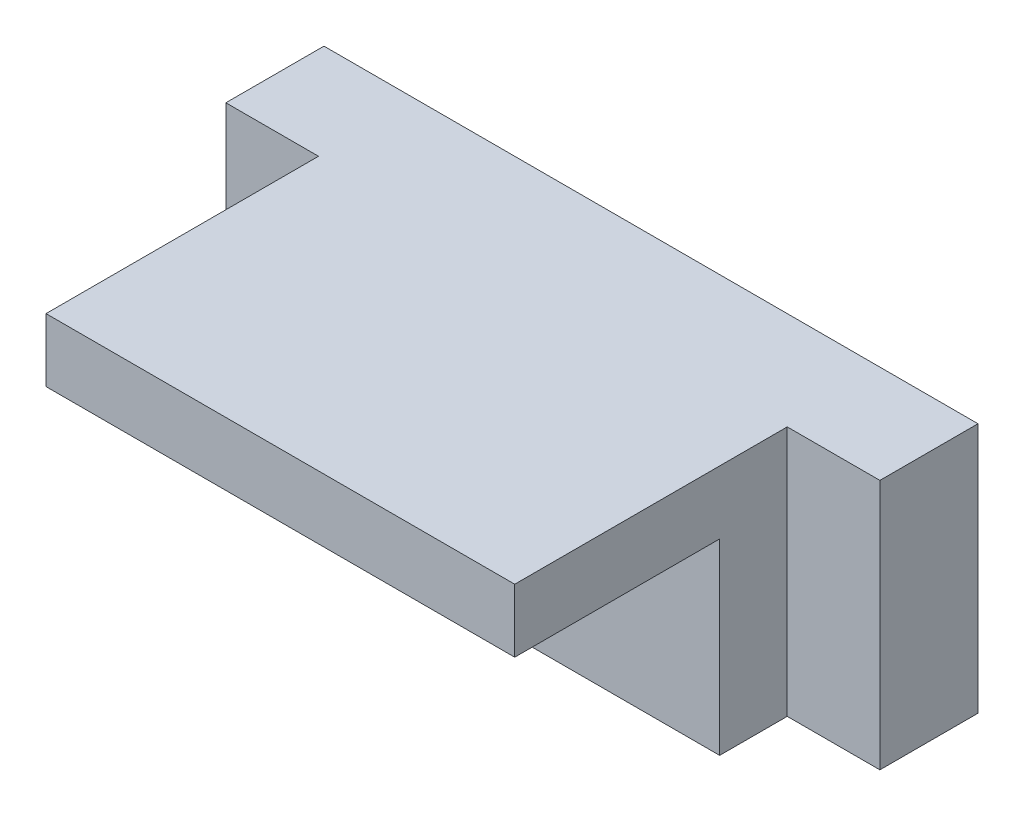
ISO-10303-21;
HEADER;
FILE_DESCRIPTION(('STEP AP214'),'2;1');
FILE_NAME('part.step','',(''),(''),'','','');
FILE_SCHEMA(('AUTOMOTIVE_DESIGN { 1 0 10303 214 1 1 1 1 }'));
ENDSEC;
DATA;
#1=APPLICATION_CONTEXT('core data for automotive mechanical design processes');
#2=APPLICATION_PROTOCOL_DEFINITION('international standard','automotive_design',2000,#1);
#3=PRODUCT_CONTEXT('',#1,'mechanical');
#4=PRODUCT('Part','Part','',(#3));
#5=PRODUCT_RELATED_PRODUCT_CATEGORY('part','',(#4));
#6=PRODUCT_DEFINITION_FORMATION('','',#4);
#7=PRODUCT_DEFINITION_CONTEXT('part definition',#1,'design');
#8=PRODUCT_DEFINITION('design','',#6,#7);
#9=PRODUCT_DEFINITION_SHAPE('','',#8);
#10=(LENGTH_UNIT() NAMED_UNIT(*) SI_UNIT(.MILLI.,.METRE.));
#11=(NAMED_UNIT(*) PLANE_ANGLE_UNIT() SI_UNIT($,.RADIAN.));
#12=(NAMED_UNIT(*) SI_UNIT($,.STERADIAN.) SOLID_ANGLE_UNIT());
#13=UNCERTAINTY_MEASURE_WITH_UNIT(LENGTH_MEASURE(1.E-05),#10,'distance_accuracy_value','');
#14=(GEOMETRIC_REPRESENTATION_CONTEXT(3) GLOBAL_UNCERTAINTY_ASSIGNED_CONTEXT((#13)) GLOBAL_UNIT_ASSIGNED_CONTEXT((#10,
#11,#12)) REPRESENTATION_CONTEXT('',''));
#15=CARTESIAN_POINT('',(0.,0.,0.));
#16=DIRECTION('',(0.,0.,1.));
#17=DIRECTION('',(1.,0.,0.));
#18=AXIS2_PLACEMENT_3D('',#15,#16,#17);
#19=CARTESIAN_POINT('',(21.5,23.,-25.));
#20=DIRECTION('',(0.,0.,-1.));
#21=DIRECTION('',(-1.,0.,0.));
#22=AXIS2_PLACEMENT_3D('',#19,#20,#21);
#23=PLANE('',#22);
#24=DIRECTION('',(1.,0.,0.));
#25=VECTOR('',#24,1.);
#26=CARTESIAN_POINT('',(21.5,0.,-25.));
#27=LINE('',#26,#25);
#28=CARTESIAN_POINT('',(21.5,0.,-25.));
#29=VERTEX_POINT('',#28);
#30=CARTESIAN_POINT('',(30.,0.,-25.));
#31=VERTEX_POINT('',#30);
#32=EDGE_CURVE('E136',#29,#31,#27,.T.);
#33=ORIENTED_EDGE('',*,*,#32,.T.);
#34=DIRECTION('',(0.,-1.,0.));
#35=VECTOR('',#34,1.);
#36=CARTESIAN_POINT('',(30.,23.,-25.));
#37=LINE('',#36,#35);
#38=CARTESIAN_POINT('',(30.,23.,-25.));
#39=VERTEX_POINT('',#38);
#40=EDGE_CURVE('E40',#39,#31,#37,.T.);
#41=ORIENTED_EDGE('',*,*,#40,.F.);
#42=DIRECTION('',(1.,0.,0.));
#43=VECTOR('',#42,1.);
#44=CARTESIAN_POINT('',(21.5,23.,-25.));
#45=LINE('',#44,#43);
#46=CARTESIAN_POINT('',(21.5,23.,-25.));
#47=VERTEX_POINT('',#46);
#48=EDGE_CURVE('E151',#47,#39,#45,.T.);
#49=ORIENTED_EDGE('',*,*,#48,.F.);
#50=DIRECTION('',(0.,-1.,0.));
#51=VECTOR('',#50,1.);
#52=CARTESIAN_POINT('',(21.5,23.,-25.));
#53=LINE('',#52,#51);
#54=EDGE_CURVE('E132',#47,#29,#53,.T.);
#55=ORIENTED_EDGE('',*,*,#54,.T.);
#56=EDGE_LOOP('',(#33,#41,#49,#55));
#57=FACE_BOUND('',#56,.T.);
#58=ADVANCED_FACE('F33',(#57),#23,.F.);
#59=CARTESIAN_POINT('',(30.,23.,-25.));
#60=DIRECTION('',(-1.,0.,0.));
#61=DIRECTION('',(0.,0.,1.));
#62=AXIS2_PLACEMENT_3D('',#59,#60,#61);
#63=PLANE('',#62);
#64=DIRECTION('',(0.,0.,-1.));
#65=VECTOR('',#64,1.);
#66=CARTESIAN_POINT('',(30.,0.,-25.));
#67=LINE('',#66,#65);
#68=CARTESIAN_POINT('',(30.,0.,-34.));
#69=VERTEX_POINT('',#68);
#70=EDGE_CURVE('E139',#31,#69,#67,.T.);
#71=ORIENTED_EDGE('',*,*,#70,.T.);
#72=DIRECTION('',(0.,-1.,0.));
#73=VECTOR('',#72,1.);
#74=CARTESIAN_POINT('',(30.,23.,-34.));
#75=LINE('',#74,#73);
#76=CARTESIAN_POINT('',(30.,23.,-34.));
#77=VERTEX_POINT('',#76);
#78=EDGE_CURVE('E161',#77,#69,#75,.T.);
#79=ORIENTED_EDGE('',*,*,#78,.F.);
#80=DIRECTION('',(0.,0.,-1.));
#81=VECTOR('',#80,1.);
#82=CARTESIAN_POINT('',(30.,23.,-25.));
#83=LINE('',#82,#81);
#84=EDGE_CURVE('E91',#39,#77,#83,.T.);
#85=ORIENTED_EDGE('',*,*,#84,.F.);
#86=ORIENTED_EDGE('',*,*,#40,.T.);
#87=EDGE_LOOP('',(#71,#79,#85,#86));
#88=FACE_BOUND('',#87,.T.);
#89=ADVANCED_FACE('F164',(#88),#63,.F.);
#90=CARTESIAN_POINT('',(30.,23.,-34.));
#91=DIRECTION('',(0.,0.,1.));
#92=DIRECTION('',(1.,0.,0.));
#93=AXIS2_PLACEMENT_3D('',#90,#91,#92);
#94=PLANE('',#93);
#95=DIRECTION('',(-1.,0.,0.));
#96=VECTOR('',#95,1.);
#97=CARTESIAN_POINT('',(30.,0.,-34.));
#98=LINE('',#97,#96);
#99=CARTESIAN_POINT('',(-30.,0.,-34.));
#100=VERTEX_POINT('',#99);
#101=EDGE_CURVE('E141',#69,#100,#98,.T.);
#102=ORIENTED_EDGE('',*,*,#101,.T.);
#103=DIRECTION('',(0.,-1.,0.));
#104=VECTOR('',#103,1.);
#105=CARTESIAN_POINT('',(-30.,23.,-34.));
#106=LINE('',#105,#104);
#107=CARTESIAN_POINT('',(-30.,23.,-34.));
#108=VERTEX_POINT('',#107);
#109=EDGE_CURVE('E158',#108,#100,#106,.T.);
#110=ORIENTED_EDGE('',*,*,#109,.F.);
#111=DIRECTION('',(-1.,0.,0.));
#112=VECTOR('',#111,1.);
#113=CARTESIAN_POINT('',(30.,23.,-34.));
#114=LINE('',#113,#112);
#115=EDGE_CURVE('E183',#77,#108,#114,.T.);
#116=ORIENTED_EDGE('',*,*,#115,.F.);
#117=ORIENTED_EDGE('',*,*,#78,.T.);
#118=EDGE_LOOP('',(#102,#110,#116,#117));
#119=FACE_BOUND('',#118,.T.);
#120=ADVANCED_FACE('F176',(#119),#94,.F.);
#121=CARTESIAN_POINT('',(-30.,23.,-25.));
#122=DIRECTION('',(1.,0.,0.));
#123=DIRECTION('',(0.,0.,-1.));
#124=AXIS2_PLACEMENT_3D('',#121,#122,#123);
#125=PLANE('',#124);
#126=DIRECTION('',(0.,0.,1.));
#127=VECTOR('',#126,1.);
#128=CARTESIAN_POINT('',(-30.,0.,-25.));
#129=LINE('',#128,#127);
#130=CARTESIAN_POINT('',(-30.,0.,-25.));
#131=VERTEX_POINT('',#130);
#132=EDGE_CURVE('E143',#100,#131,#129,.T.);
#133=ORIENTED_EDGE('',*,*,#132,.T.);
#134=DIRECTION('',(0.,-1.,0.));
#135=VECTOR('',#134,1.);
#136=CARTESIAN_POINT('',(-30.,23.,-25.));
#137=LINE('',#136,#135);
#138=CARTESIAN_POINT('',(-30.,23.,-25.));
#139=VERTEX_POINT('',#138);
#140=EDGE_CURVE('E155',#139,#131,#137,.T.);
#141=ORIENTED_EDGE('',*,*,#140,.F.);
#142=DIRECTION('',(0.,0.,1.));
#143=VECTOR('',#142,1.);
#144=CARTESIAN_POINT('',(-30.,23.,-25.));
#145=LINE('',#144,#143);
#146=EDGE_CURVE('E182',#108,#139,#145,.T.);
#147=ORIENTED_EDGE('',*,*,#146,.F.);
#148=ORIENTED_EDGE('',*,*,#109,.T.);
#149=EDGE_LOOP('',(#133,#141,#147,#148));
#150=FACE_BOUND('',#149,.T.);
#151=ADVANCED_FACE('F180',(#150),#125,.F.);
#152=CARTESIAN_POINT('',(-21.5,23.,-25.));
#153=DIRECTION('',(0.,0.,-1.));
#154=DIRECTION('',(-1.,0.,0.));
#155=AXIS2_PLACEMENT_3D('',#152,#153,#154);
#156=PLANE('',#155);
#157=DIRECTION('',(1.,0.,0.));
#158=VECTOR('',#157,1.);
#159=CARTESIAN_POINT('',(-21.5,0.,-25.));
#160=LINE('',#159,#158);
#161=CARTESIAN_POINT('',(-21.5,0.,-25.));
#162=VERTEX_POINT('',#161);
#163=EDGE_CURVE('E145',#131,#162,#160,.T.);
#164=ORIENTED_EDGE('',*,*,#163,.T.);
#165=DIRECTION('',(0.,-1.,0.));
#166=VECTOR('',#165,1.);
#167=CARTESIAN_POINT('',(-21.5,23.,-25.));
#168=LINE('',#167,#166);
#169=CARTESIAN_POINT('',(-21.5,23.,-25.));
#170=VERTEX_POINT('',#169);
#171=EDGE_CURVE('E126',#170,#162,#168,.T.);
#172=ORIENTED_EDGE('',*,*,#171,.F.);
#173=DIRECTION('',(1.,0.,0.));
#174=VECTOR('',#173,1.);
#175=CARTESIAN_POINT('',(-21.5,23.,-25.));
#176=LINE('',#175,#174);
#177=EDGE_CURVE('E113',#139,#170,#176,.T.);
#178=ORIENTED_EDGE('',*,*,#177,.F.);
#179=ORIENTED_EDGE('',*,*,#140,.T.);
#180=EDGE_LOOP('',(#164,#172,#178,#179));
#181=FACE_BOUND('',#180,.T.);
#182=ADVANCED_FACE('F232',(#181),#156,.F.);
#183=CARTESIAN_POINT('',(-21.5,23.,0.));
#184=DIRECTION('',(1.,0.,0.));
#185=DIRECTION('',(0.,0.,-1.));
#186=AXIS2_PLACEMENT_3D('',#183,#184,#185);
#187=PLANE('',#186);
#188=DIRECTION('',(0.,1.,0.));
#189=VECTOR('',#188,1.);
#190=CARTESIAN_POINT('',(-21.5,23.,-18.8));
#191=LINE('',#190,#189);
#192=CARTESIAN_POINT('',(-21.5,0.,-18.8));
#193=VERTEX_POINT('',#192);
#194=CARTESIAN_POINT('',(-21.5,17.2,-18.8));
#195=VERTEX_POINT('',#194);
#196=EDGE_CURVE('E47',#193,#195,#191,.T.);
#197=ORIENTED_EDGE('',*,*,#196,.T.);
#198=DIRECTION('',(0.,0.,1.));
#199=VECTOR('',#198,1.);
#200=CARTESIAN_POINT('',(-21.5,17.2,0.));
#201=LINE('',#200,#199);
#202=CARTESIAN_POINT('',(-21.5,17.2,0.));
#203=VERTEX_POINT('',#202);
#204=EDGE_CURVE('E123',#195,#203,#201,.T.);
#205=ORIENTED_EDGE('',*,*,#204,.T.);
#206=DIRECTION('',(0.,-1.,0.));
#207=VECTOR('',#206,1.);
#208=CARTESIAN_POINT('',(-21.5,23.,0.));
#209=LINE('',#208,#207);
#210=CARTESIAN_POINT('',(-21.5,23.,0.));
#211=VERTEX_POINT('',#210);
#212=EDGE_CURVE('E120',#211,#203,#209,.T.);
#213=ORIENTED_EDGE('',*,*,#212,.F.);
#214=DIRECTION('',(0.,0.,1.));
#215=VECTOR('',#214,1.);
#216=CARTESIAN_POINT('',(-21.5,23.,0.));
#217=LINE('',#216,#215);
#218=EDGE_CURVE('E106',#170,#211,#217,.T.);
#219=ORIENTED_EDGE('',*,*,#218,.F.);
#220=ORIENTED_EDGE('',*,*,#171,.T.);
#221=DIRECTION('',(0.,0.,1.));
#222=VECTOR('',#221,1.);
#223=CARTESIAN_POINT('',(-21.5,0.,0.));
#224=LINE('',#223,#222);
#225=EDGE_CURVE('E147',#162,#193,#224,.T.);
#226=ORIENTED_EDGE('',*,*,#225,.T.);
#227=EDGE_LOOP('',(#197,#205,#213,#219,#220,#226));
#228=FACE_BOUND('',#227,.T.);
#229=ADVANCED_FACE('F121',(#228),#187,.F.);
#230=CARTESIAN_POINT('',(-21.5,23.,0.));
#231=DIRECTION('',(0.,0.,-1.));
#232=DIRECTION('',(-1.,0.,0.));
#233=AXIS2_PLACEMENT_3D('',#230,#231,#232);
#234=PLANE('',#233);
#235=ORIENTED_EDGE('',*,*,#212,.T.);
#236=DIRECTION('',(1.,0.,0.));
#237=VECTOR('',#236,1.);
#238=CARTESIAN_POINT('',(-29.5,17.2,0.));
#239=LINE('',#238,#237);
#240=CARTESIAN_POINT('',(21.5,17.2,0.));
#241=VERTEX_POINT('',#240);
#242=EDGE_CURVE('E191',#203,#241,#239,.T.);
#243=ORIENTED_EDGE('',*,*,#242,.T.);
#244=DIRECTION('',(0.,-1.,0.));
#245=VECTOR('',#244,1.);
#246=CARTESIAN_POINT('',(21.5,23.,0.));
#247=LINE('',#246,#245);
#248=CARTESIAN_POINT('',(21.5,23.,0.));
#249=VERTEX_POINT('',#248);
#250=EDGE_CURVE('E127',#249,#241,#247,.T.);
#251=ORIENTED_EDGE('',*,*,#250,.F.);
#252=DIRECTION('',(1.,0.,0.));
#253=VECTOR('',#252,1.);
#254=CARTESIAN_POINT('',(-21.5,23.,0.));
#255=LINE('',#254,#253);
#256=EDGE_CURVE('E110',#211,#249,#255,.T.);
#257=ORIENTED_EDGE('',*,*,#256,.F.);
#258=EDGE_LOOP('',(#235,#243,#251,#257));
#259=FACE_BOUND('',#258,.T.);
#260=ADVANCED_FACE('F129',(#259),#234,.F.);
#261=CARTESIAN_POINT('',(21.5,23.,0.));
#262=DIRECTION('',(-1.,0.,0.));
#263=DIRECTION('',(0.,0.,1.));
#264=AXIS2_PLACEMENT_3D('',#261,#262,#263);
#265=PLANE('',#264);
#266=ORIENTED_EDGE('',*,*,#250,.T.);
#267=DIRECTION('',(0.,0.,1.));
#268=VECTOR('',#267,1.);
#269=CARTESIAN_POINT('',(21.5,17.2,0.));
#270=LINE('',#269,#268);
#271=CARTESIAN_POINT('',(21.5,17.2,-18.8));
#272=VERTEX_POINT('',#271);
#273=EDGE_CURVE('E195',#272,#241,#270,.T.);
#274=ORIENTED_EDGE('',*,*,#273,.F.);
#275=DIRECTION('',(0.,1.,0.));
#276=VECTOR('',#275,1.);
#277=CARTESIAN_POINT('',(21.5,0.,-18.8));
#278=LINE('',#277,#276);
#279=CARTESIAN_POINT('',(21.5,0.,-18.8));
#280=VERTEX_POINT('',#279);
#281=EDGE_CURVE('E199',#280,#272,#278,.T.);
#282=ORIENTED_EDGE('',*,*,#281,.F.);
#283=DIRECTION('',(0.,0.,-1.));
#284=VECTOR('',#283,1.);
#285=CARTESIAN_POINT('',(21.5,0.,0.));
#286=LINE('',#285,#284);
#287=EDGE_CURVE('E82',#280,#29,#286,.T.);
#288=ORIENTED_EDGE('',*,*,#287,.T.);
#289=ORIENTED_EDGE('',*,*,#54,.F.);
#290=DIRECTION('',(0.,0.,-1.));
#291=VECTOR('',#290,1.);
#292=CARTESIAN_POINT('',(21.5,23.,0.));
#293=LINE('',#292,#291);
#294=EDGE_CURVE('E55',#249,#47,#293,.T.);
#295=ORIENTED_EDGE('',*,*,#294,.F.);
#296=EDGE_LOOP('',(#266,#274,#282,#288,#289,#295));
#297=FACE_BOUND('',#296,.T.);
#298=ADVANCED_FACE('F207',(#297),#265,.F.);
#299=CARTESIAN_POINT('',(0.,23.,0.));
#300=DIRECTION('',(0.,1.,0.));
#301=DIRECTION('',(0.,0.,1.));
#302=AXIS2_PLACEMENT_3D('',#299,#300,#301);
#303=PLANE('',#302);
#304=ORIENTED_EDGE('',*,*,#48,.T.);
#305=ORIENTED_EDGE('',*,*,#84,.T.);
#306=ORIENTED_EDGE('',*,*,#115,.T.);
#307=ORIENTED_EDGE('',*,*,#146,.T.);
#308=ORIENTED_EDGE('',*,*,#177,.T.);
#309=ORIENTED_EDGE('',*,*,#218,.T.);
#310=ORIENTED_EDGE('',*,*,#256,.T.);
#311=ORIENTED_EDGE('',*,*,#294,.T.);
#312=EDGE_LOOP('',(#304,#305,#306,#307,#308,#309,#310,#311));
#313=FACE_BOUND('',#312,.T.);
#314=ADVANCED_FACE('F108',(#313),#303,.T.);
#315=CARTESIAN_POINT('',(0.,0.,0.));
#316=DIRECTION('',(0.,1.,0.));
#317=DIRECTION('',(0.,0.,1.));
#318=AXIS2_PLACEMENT_3D('',#315,#316,#317);
#319=PLANE('',#318);
#320=ORIENTED_EDGE('',*,*,#287,.F.);
#321=DIRECTION('',(-1.,0.,0.));
#322=VECTOR('',#321,1.);
#323=CARTESIAN_POINT('',(0.,0.,-18.8));
#324=LINE('',#323,#322);
#325=EDGE_CURVE('E11',#280,#193,#324,.T.);
#326=ORIENTED_EDGE('',*,*,#325,.T.);
#327=ORIENTED_EDGE('',*,*,#225,.F.);
#328=ORIENTED_EDGE('',*,*,#163,.F.);
#329=ORIENTED_EDGE('',*,*,#132,.F.);
#330=ORIENTED_EDGE('',*,*,#101,.F.);
#331=ORIENTED_EDGE('',*,*,#70,.F.);
#332=ORIENTED_EDGE('',*,*,#32,.F.);
#333=EDGE_LOOP('',(#320,#326,#327,#328,#329,#330,#331,#332));
#334=FACE_BOUND('',#333,.T.);
#335=ADVANCED_FACE('F169',(#334),#319,.F.);
#336=CARTESIAN_POINT('',(-29.5,17.2,0.));
#337=DIRECTION('',(0.,1.,0.));
#338=DIRECTION('',(0.,0.,1.));
#339=AXIS2_PLACEMENT_3D('',#336,#337,#338);
#340=PLANE('',#339);
#341=DIRECTION('',(1.,0.,0.));
#342=VECTOR('',#341,1.);
#343=CARTESIAN_POINT('',(-29.5,17.2,-18.8));
#344=LINE('',#343,#342);
#345=EDGE_CURVE('E192',#195,#272,#344,.T.);
#346=ORIENTED_EDGE('',*,*,#345,.T.);
#347=ORIENTED_EDGE('',*,*,#273,.T.);
#348=ORIENTED_EDGE('',*,*,#242,.F.);
#349=ORIENTED_EDGE('',*,*,#204,.F.);
#350=EDGE_LOOP('',(#346,#347,#348,#349));
#351=FACE_BOUND('',#350,.T.);
#352=ADVANCED_FACE('F210',(#351),#340,.F.);
#353=CARTESIAN_POINT('',(-29.5,0.,-18.8));
#354=DIRECTION('',(0.,0.,-1.));
#355=DIRECTION('',(-1.,0.,0.));
#356=AXIS2_PLACEMENT_3D('',#353,#354,#355);
#357=PLANE('',#356);
#358=ORIENTED_EDGE('',*,*,#325,.F.);
#359=ORIENTED_EDGE('',*,*,#281,.T.);
#360=ORIENTED_EDGE('',*,*,#345,.F.);
#361=ORIENTED_EDGE('',*,*,#196,.F.);
#362=EDGE_LOOP('',(#358,#359,#360,#361));
#363=FACE_BOUND('',#362,.T.);
#364=ADVANCED_FACE('F203',(#363),#357,.F.);
#365=CLOSED_SHELL('',(#58,#89,#120,#151,#182,#229,#260,#298,#314,#335,#352,#364));
#366=MANIFOLD_SOLID_BREP('B2',#365);
#367=ADVANCED_BREP_SHAPE_REPRESENTATION('',(#18,#366),#14);
#368=SHAPE_DEFINITION_REPRESENTATION(#9,#367);
ENDSEC;
END-ISO-10303-21;
